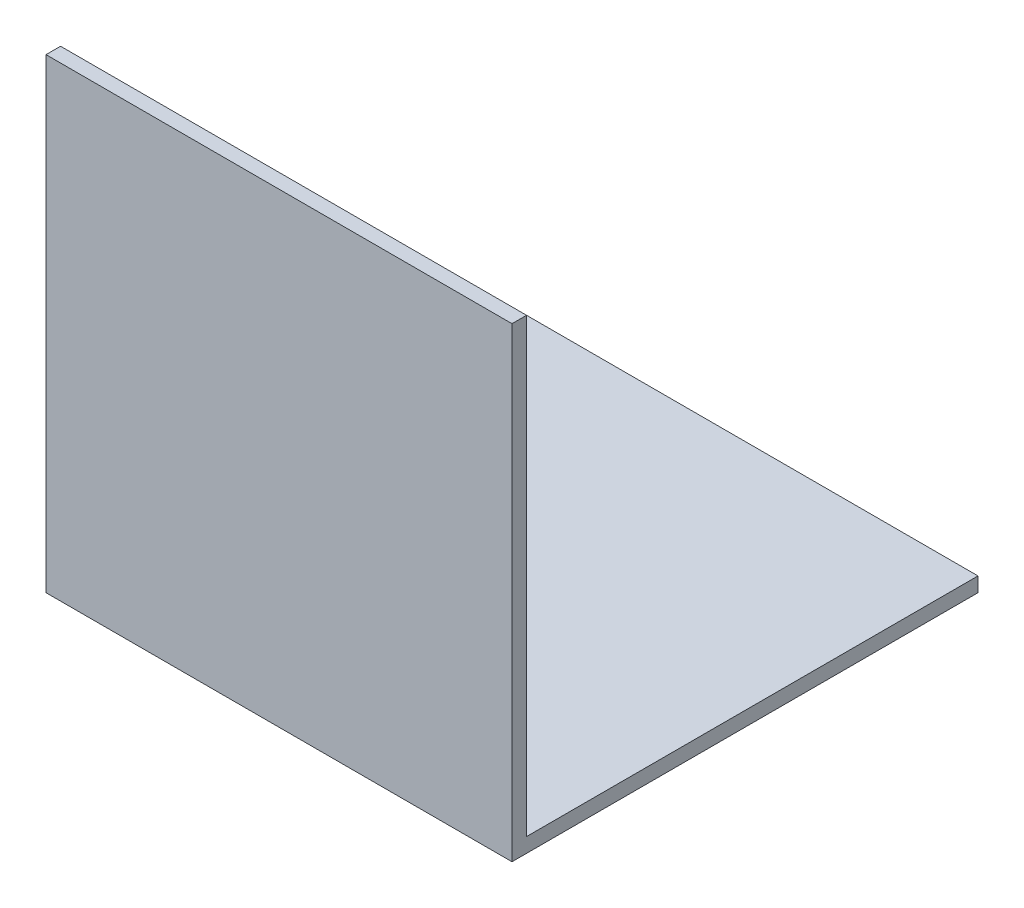
ISO-10303-21;
HEADER;
FILE_DESCRIPTION(('STEP AP214'),'2;1');
FILE_NAME('part.step','',(''),(''),'','','');
FILE_SCHEMA(('AUTOMOTIVE_DESIGN { 1 0 10303 214 1 1 1 1 }'));
ENDSEC;
DATA;
#1=APPLICATION_CONTEXT('core data for automotive mechanical design processes');
#2=APPLICATION_PROTOCOL_DEFINITION('international standard','automotive_design',2000,#1);
#3=PRODUCT_CONTEXT('',#1,'mechanical');
#4=PRODUCT('Part','Part','',(#3));
#5=PRODUCT_RELATED_PRODUCT_CATEGORY('part','',(#4));
#6=PRODUCT_DEFINITION_FORMATION('','',#4);
#7=PRODUCT_DEFINITION_CONTEXT('part definition',#1,'design');
#8=PRODUCT_DEFINITION('design','',#6,#7);
#9=PRODUCT_DEFINITION_SHAPE('','',#8);
#10=(LENGTH_UNIT() NAMED_UNIT(*) SI_UNIT(.MILLI.,.METRE.));
#11=(NAMED_UNIT(*) PLANE_ANGLE_UNIT() SI_UNIT($,.RADIAN.));
#12=(NAMED_UNIT(*) SI_UNIT($,.STERADIAN.) SOLID_ANGLE_UNIT());
#13=UNCERTAINTY_MEASURE_WITH_UNIT(LENGTH_MEASURE(1.E-05),#10,'distance_accuracy_value','');
#14=(GEOMETRIC_REPRESENTATION_CONTEXT(3) GLOBAL_UNCERTAINTY_ASSIGNED_CONTEXT((#13)) GLOBAL_UNIT_ASSIGNED_CONTEXT((#10,
#11,#12)) REPRESENTATION_CONTEXT('',''));
#15=CARTESIAN_POINT('',(0.,0.,0.));
#16=DIRECTION('',(0.,0.,1.));
#17=DIRECTION('',(1.,0.,0.));
#18=AXIS2_PLACEMENT_3D('',#15,#16,#17);
#19=CARTESIAN_POINT('',(0.,0.79375,0.));
#20=DIRECTION('',(1.,0.,0.));
#21=DIRECTION('',(0.,0.,-1.));
#22=AXIS2_PLACEMENT_3D('',#19,#20,#21);
#23=PLANE('',#22);
#24=DIRECTION('',(0.,0.,1.));
#25=VECTOR('',#24,1.);
#26=CARTESIAN_POINT('',(0.,0.,0.));
#27=LINE('',#26,#25);
#28=CARTESIAN_POINT('',(0.,0.,-25.4));
#29=VERTEX_POINT('',#28);
#30=CARTESIAN_POINT('',(0.,0.,0.));
#31=VERTEX_POINT('',#30);
#32=EDGE_CURVE('E84',#29,#31,#27,.T.);
#33=ORIENTED_EDGE('',*,*,#32,.T.);
#34=DIRECTION('',(0.,-1.,0.));
#35=VECTOR('',#34,1.);
#36=CARTESIAN_POINT('',(0.,0.79375,0.));
#37=LINE('',#36,#35);
#38=CARTESIAN_POINT('',(0.,25.4,0.));
#39=VERTEX_POINT('',#38);
#40=EDGE_CURVE('E11',#39,#31,#37,.T.);
#41=ORIENTED_EDGE('',*,*,#40,.F.);
#42=DIRECTION('',(0.,0.,1.));
#43=VECTOR('',#42,1.);
#44=CARTESIAN_POINT('',(0.,25.4,0.));
#45=LINE('',#44,#43);
#46=CARTESIAN_POINT('',(0.,25.4,-0.79375));
#47=VERTEX_POINT('',#46);
#48=EDGE_CURVE('E122',#47,#39,#45,.T.);
#49=ORIENTED_EDGE('',*,*,#48,.F.);
#50=DIRECTION('',(0.,1.,0.));
#51=VECTOR('',#50,1.);
#52=CARTESIAN_POINT('',(0.,0.,-0.79375));
#53=LINE('',#52,#51);
#54=CARTESIAN_POINT('',(0.,0.79375,-0.79375));
#55=VERTEX_POINT('',#54);
#56=EDGE_CURVE('E139',#55,#47,#53,.T.);
#57=ORIENTED_EDGE('',*,*,#56,.F.);
#58=DIRECTION('',(0.,0.,1.));
#59=VECTOR('',#58,1.);
#60=CARTESIAN_POINT('',(0.,0.79375,0.));
#61=LINE('',#60,#59);
#62=CARTESIAN_POINT('',(0.,0.79375,-25.4));
#63=VERTEX_POINT('',#62);
#64=EDGE_CURVE('E46',#63,#55,#61,.T.);
#65=ORIENTED_EDGE('',*,*,#64,.F.);
#66=DIRECTION('',(0.,-1.,0.));
#67=VECTOR('',#66,1.);
#68=CARTESIAN_POINT('',(0.,0.79375,-25.4));
#69=LINE('',#68,#67);
#70=EDGE_CURVE('E74',#63,#29,#69,.T.);
#71=ORIENTED_EDGE('',*,*,#70,.T.);
#72=EDGE_LOOP('',(#33,#41,#49,#57,#65,#71));
#73=FACE_BOUND('',#72,.T.);
#74=ADVANCED_FACE('F32',(#73),#23,.F.);
#75=CARTESIAN_POINT('',(0.,0.79375,0.));
#76=DIRECTION('',(0.,0.,-1.));
#77=DIRECTION('',(-1.,0.,0.));
#78=AXIS2_PLACEMENT_3D('',#75,#76,#77);
#79=PLANE('',#78);
#80=DIRECTION('',(1.,0.,0.));
#81=VECTOR('',#80,1.);
#82=CARTESIAN_POINT('',(0.,0.,0.));
#83=LINE('',#82,#81);
#84=CARTESIAN_POINT('',(25.4,0.,0.));
#85=VERTEX_POINT('',#84);
#86=EDGE_CURVE('E89',#31,#85,#83,.T.);
#87=ORIENTED_EDGE('',*,*,#86,.T.);
#88=DIRECTION('',(0.,-1.,0.));
#89=VECTOR('',#88,1.);
#90=CARTESIAN_POINT('',(25.4,0.79375,0.));
#91=LINE('',#90,#89);
#92=CARTESIAN_POINT('',(25.4,25.4,0.));
#93=VERTEX_POINT('',#92);
#94=EDGE_CURVE('E39',#93,#85,#91,.T.);
#95=ORIENTED_EDGE('',*,*,#94,.F.);
#96=DIRECTION('',(1.,0.,0.));
#97=VECTOR('',#96,1.);
#98=CARTESIAN_POINT('',(0.,25.4,0.));
#99=LINE('',#98,#97);
#100=EDGE_CURVE('E93',#39,#93,#99,.T.);
#101=ORIENTED_EDGE('',*,*,#100,.F.);
#102=ORIENTED_EDGE('',*,*,#40,.T.);
#103=EDGE_LOOP('',(#87,#95,#101,#102));
#104=FACE_BOUND('',#103,.T.);
#105=ADVANCED_FACE('F112',(#104),#79,.F.);
#106=CARTESIAN_POINT('',(25.4,0.79375,0.));
#107=DIRECTION('',(-1.,0.,0.));
#108=DIRECTION('',(0.,0.,1.));
#109=AXIS2_PLACEMENT_3D('',#106,#107,#108);
#110=PLANE('',#109);
#111=DIRECTION('',(0.,0.,-1.));
#112=VECTOR('',#111,1.);
#113=CARTESIAN_POINT('',(25.4,0.79375,0.));
#114=LINE('',#113,#112);
#115=CARTESIAN_POINT('',(25.4,0.79375,-0.79375));
#116=VERTEX_POINT('',#115);
#117=CARTESIAN_POINT('',(25.4,0.79375,-25.4));
#118=VERTEX_POINT('',#117);
#119=EDGE_CURVE('E130',#116,#118,#114,.T.);
#120=ORIENTED_EDGE('',*,*,#119,.F.);
#121=DIRECTION('',(0.,1.,0.));
#122=VECTOR('',#121,1.);
#123=CARTESIAN_POINT('',(25.4,0.,-0.79375));
#124=LINE('',#123,#122);
#125=CARTESIAN_POINT('',(25.4,25.4,-0.79375));
#126=VERTEX_POINT('',#125);
#127=EDGE_CURVE('E133',#116,#126,#124,.T.);
#128=ORIENTED_EDGE('',*,*,#127,.T.);
#129=DIRECTION('',(0.,0.,1.));
#130=VECTOR('',#129,1.);
#131=CARTESIAN_POINT('',(25.4,25.4,0.));
#132=LINE('',#131,#130);
#133=EDGE_CURVE('E108',#126,#93,#132,.T.);
#134=ORIENTED_EDGE('',*,*,#133,.T.);
#135=ORIENTED_EDGE('',*,*,#94,.T.);
#136=DIRECTION('',(0.,0.,-1.));
#137=VECTOR('',#136,1.);
#138=CARTESIAN_POINT('',(25.4,0.,0.));
#139=LINE('',#138,#137);
#140=CARTESIAN_POINT('',(25.4,0.,-25.4));
#141=VERTEX_POINT('',#140);
#142=EDGE_CURVE('E80',#85,#141,#139,.T.);
#143=ORIENTED_EDGE('',*,*,#142,.T.);
#144=DIRECTION('',(0.,-1.,0.));
#145=VECTOR('',#144,1.);
#146=CARTESIAN_POINT('',(25.4,0.79375,-25.4));
#147=LINE('',#146,#145);
#148=EDGE_CURVE('E76',#118,#141,#147,.T.);
#149=ORIENTED_EDGE('',*,*,#148,.F.);
#150=EDGE_LOOP('',(#120,#128,#134,#135,#143,#149));
#151=FACE_BOUND('',#150,.T.);
#152=ADVANCED_FACE('F104',(#151),#110,.F.);
#153=CARTESIAN_POINT('',(0.,0.79375,-25.4));
#154=DIRECTION('',(0.,0.,1.));
#155=DIRECTION('',(1.,0.,0.));
#156=AXIS2_PLACEMENT_3D('',#153,#154,#155);
#157=PLANE('',#156);
#158=DIRECTION('',(-1.,0.,0.));
#159=VECTOR('',#158,1.);
#160=CARTESIAN_POINT('',(0.,0.,-25.4));
#161=LINE('',#160,#159);
#162=EDGE_CURVE('E71',#141,#29,#161,.T.);
#163=ORIENTED_EDGE('',*,*,#162,.T.);
#164=ORIENTED_EDGE('',*,*,#70,.F.);
#165=DIRECTION('',(-1.,0.,0.));
#166=VECTOR('',#165,1.);
#167=CARTESIAN_POINT('',(0.,0.79375,-25.4));
#168=LINE('',#167,#166);
#169=EDGE_CURVE('E52',#118,#63,#168,.T.);
#170=ORIENTED_EDGE('',*,*,#169,.F.);
#171=ORIENTED_EDGE('',*,*,#148,.T.);
#172=EDGE_LOOP('',(#163,#164,#170,#171));
#173=FACE_BOUND('',#172,.T.);
#174=ADVANCED_FACE('F73',(#173),#157,.F.);
#175=CARTESIAN_POINT('',(0.,0.79375,0.));
#176=DIRECTION('',(0.,-1.,0.));
#177=DIRECTION('',(0.,0.,-1.));
#178=AXIS2_PLACEMENT_3D('',#175,#176,#177);
#179=PLANE('',#178);
#180=ORIENTED_EDGE('',*,*,#64,.T.);
#181=DIRECTION('',(1.,0.,0.));
#182=VECTOR('',#181,1.);
#183=CARTESIAN_POINT('',(0.,0.79375,-0.79375));
#184=LINE('',#183,#182);
#185=EDGE_CURVE('E90',#55,#116,#184,.T.);
#186=ORIENTED_EDGE('',*,*,#185,.T.);
#187=ORIENTED_EDGE('',*,*,#119,.T.);
#188=ORIENTED_EDGE('',*,*,#169,.T.);
#189=EDGE_LOOP('',(#180,#186,#187,#188));
#190=FACE_BOUND('',#189,.T.);
#191=ADVANCED_FACE('F131',(#190),#179,.F.);
#192=CARTESIAN_POINT('',(0.,0.,0.));
#193=DIRECTION('',(0.,-1.,0.));
#194=DIRECTION('',(0.,0.,-1.));
#195=AXIS2_PLACEMENT_3D('',#192,#193,#194);
#196=PLANE('',#195);
#197=ORIENTED_EDGE('',*,*,#162,.F.);
#198=ORIENTED_EDGE('',*,*,#142,.F.);
#199=ORIENTED_EDGE('',*,*,#86,.F.);
#200=ORIENTED_EDGE('',*,*,#32,.F.);
#201=EDGE_LOOP('',(#197,#198,#199,#200));
#202=FACE_BOUND('',#201,.T.);
#203=ADVANCED_FACE('F88',(#202),#196,.T.);
#204=CARTESIAN_POINT('',(0.,0.,-0.79375));
#205=DIRECTION('',(0.,0.,-1.));
#206=DIRECTION('',(-1.,0.,0.));
#207=AXIS2_PLACEMENT_3D('',#204,#205,#206);
#208=PLANE('',#207);
#209=ORIENTED_EDGE('',*,*,#185,.F.);
#210=ORIENTED_EDGE('',*,*,#56,.T.);
#211=DIRECTION('',(1.,0.,0.));
#212=VECTOR('',#211,1.);
#213=CARTESIAN_POINT('',(0.,25.4,-0.79375));
#214=LINE('',#213,#212);
#215=EDGE_CURVE('E123',#47,#126,#214,.T.);
#216=ORIENTED_EDGE('',*,*,#215,.T.);
#217=ORIENTED_EDGE('',*,*,#127,.F.);
#218=EDGE_LOOP('',(#209,#210,#216,#217));
#219=FACE_BOUND('',#218,.T.);
#220=ADVANCED_FACE('F140',(#219),#208,.T.);
#221=CARTESIAN_POINT('',(0.,25.4,0.));
#222=DIRECTION('',(0.,1.,0.));
#223=DIRECTION('',(0.,0.,1.));
#224=AXIS2_PLACEMENT_3D('',#221,#222,#223);
#225=PLANE('',#224);
#226=ORIENTED_EDGE('',*,*,#133,.F.);
#227=ORIENTED_EDGE('',*,*,#215,.F.);
#228=ORIENTED_EDGE('',*,*,#48,.T.);
#229=ORIENTED_EDGE('',*,*,#100,.T.);
#230=EDGE_LOOP('',(#226,#227,#228,#229));
#231=FACE_BOUND('',#230,.T.);
#232=ADVANCED_FACE('F119',(#231),#225,.T.);
#233=CLOSED_SHELL('',(#74,#105,#152,#174,#191,#203,#220,#232));
#234=MANIFOLD_SOLID_BREP('B2',#233);
#235=ADVANCED_BREP_SHAPE_REPRESENTATION('',(#18,#234),#14);
#236=SHAPE_DEFINITION_REPRESENTATION(#9,#235);
ENDSEC;
END-ISO-10303-21;
